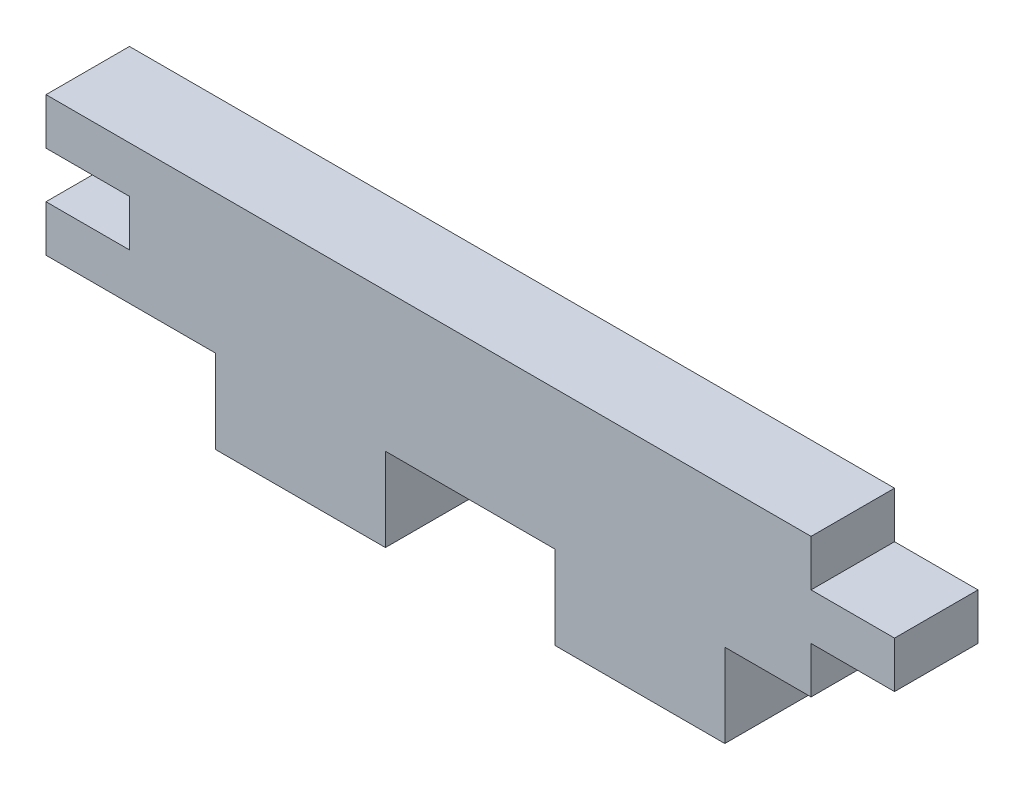
ISO-10303-21;
HEADER;
FILE_DESCRIPTION(('STEP AP214'),'2;1');
FILE_NAME('part.step','',(''),(''),'','','');
FILE_SCHEMA(('AUTOMOTIVE_DESIGN { 1 0 10303 214 1 1 1 1 }'));
ENDSEC;
DATA;
#1=APPLICATION_CONTEXT('core data for automotive mechanical design processes');
#2=APPLICATION_PROTOCOL_DEFINITION('international standard','automotive_design',2000,#1);
#3=PRODUCT_CONTEXT('',#1,'mechanical');
#4=PRODUCT('Part','Part','',(#3));
#5=PRODUCT_RELATED_PRODUCT_CATEGORY('part','',(#4));
#6=PRODUCT_DEFINITION_FORMATION('','',#4);
#7=PRODUCT_DEFINITION_CONTEXT('part definition',#1,'design');
#8=PRODUCT_DEFINITION('design','',#6,#7);
#9=PRODUCT_DEFINITION_SHAPE('','',#8);
#10=(LENGTH_UNIT() NAMED_UNIT(*) SI_UNIT(.MILLI.,.METRE.));
#11=(NAMED_UNIT(*) PLANE_ANGLE_UNIT() SI_UNIT($,.RADIAN.));
#12=(NAMED_UNIT(*) SI_UNIT($,.STERADIAN.) SOLID_ANGLE_UNIT());
#13=UNCERTAINTY_MEASURE_WITH_UNIT(LENGTH_MEASURE(1.E-05),#10,'distance_accuracy_value','');
#14=(GEOMETRIC_REPRESENTATION_CONTEXT(3) GLOBAL_UNCERTAINTY_ASSIGNED_CONTEXT((#13)) GLOBAL_UNIT_ASSIGNED_CONTEXT((#10,
#11,#12)) REPRESENTATION_CONTEXT('',''));
#15=CARTESIAN_POINT('',(0.,0.,0.));
#16=DIRECTION('',(0.,0.,1.));
#17=DIRECTION('',(1.,0.,0.));
#18=AXIS2_PLACEMENT_3D('',#15,#16,#17);
#19=CARTESIAN_POINT('',(0.,0.,15.24));
#20=DIRECTION('',(1.,0.,0.));
#21=DIRECTION('',(0.,0.,-1.));
#22=AXIS2_PLACEMENT_3D('',#19,#20,#21);
#23=PLANE('',#22);
#24=DIRECTION('',(0.,-1.,0.));
#25=VECTOR('',#24,1.);
#26=CARTESIAN_POINT('',(0.,0.,0.));
#27=LINE('',#26,#25);
#28=CARTESIAN_POINT('',(0.,40.64,0.));
#29=VERTEX_POINT('',#28);
#30=CARTESIAN_POINT('',(0.,32.1733333333333,0.));
#31=VERTEX_POINT('',#30);
#32=EDGE_CURVE('E193',#29,#31,#27,.T.);
#33=ORIENTED_EDGE('',*,*,#32,.T.);
#34=DIRECTION('',(0.,0.,1.));
#35=VECTOR('',#34,1.);
#36=CARTESIAN_POINT('',(0.,32.1733333333333,0.));
#37=LINE('',#36,#35);
#38=CARTESIAN_POINT('',(0.,32.1733333333333,15.24));
#39=VERTEX_POINT('',#38);
#40=EDGE_CURVE('E269',#31,#39,#37,.T.);
#41=ORIENTED_EDGE('',*,*,#40,.T.);
#42=DIRECTION('',(0.,-1.,0.));
#43=VECTOR('',#42,1.);
#44=CARTESIAN_POINT('',(0.,0.,15.24));
#45=LINE('',#44,#43);
#46=CARTESIAN_POINT('',(0.,40.64,15.24));
#47=VERTEX_POINT('',#46);
#48=EDGE_CURVE('E213',#47,#39,#45,.T.);
#49=ORIENTED_EDGE('',*,*,#48,.F.);
#50=DIRECTION('',(0.,0.,-1.));
#51=VECTOR('',#50,1.);
#52=CARTESIAN_POINT('',(0.,40.64,15.24));
#53=LINE('',#52,#51);
#54=EDGE_CURVE('E11',#47,#29,#53,.T.);
#55=ORIENTED_EDGE('',*,*,#54,.T.);
#56=EDGE_LOOP('',(#33,#41,#49,#55));
#57=FACE_BOUND('',#56,.T.);
#58=ADVANCED_FACE('F33',(#57),#23,.F.);
#59=CARTESIAN_POINT('',(0.,0.,15.24));
#60=DIRECTION('',(0.,1.,0.));
#61=DIRECTION('',(0.,0.,1.));
#62=AXIS2_PLACEMENT_3D('',#59,#60,#61);
#63=PLANE('',#62);
#64=DIRECTION('',(1.,0.,0.));
#65=VECTOR('',#64,1.);
#66=CARTESIAN_POINT('',(0.,0.,15.24));
#67=LINE('',#66,#65);
#68=CARTESIAN_POINT('',(30.988,0.,15.24));
#69=VERTEX_POINT('',#68);
#70=CARTESIAN_POINT('',(61.976,0.,15.24));
#71=VERTEX_POINT('',#70);
#72=EDGE_CURVE('E225',#69,#71,#67,.T.);
#73=ORIENTED_EDGE('',*,*,#72,.F.);
#74=DIRECTION('',(0.,0.,1.));
#75=VECTOR('',#74,1.);
#76=CARTESIAN_POINT('',(30.988,0.,0.));
#77=LINE('',#76,#75);
#78=CARTESIAN_POINT('',(30.988,0.,0.));
#79=VERTEX_POINT('',#78);
#80=EDGE_CURVE('E245',#79,#69,#77,.T.);
#81=ORIENTED_EDGE('',*,*,#80,.F.);
#82=DIRECTION('',(1.,0.,0.));
#83=VECTOR('',#82,1.);
#84=CARTESIAN_POINT('',(0.,0.,0.));
#85=LINE('',#84,#83);
#86=CARTESIAN_POINT('',(61.976,0.,0.));
#87=VERTEX_POINT('',#86);
#88=EDGE_CURVE('E205',#79,#87,#85,.T.);
#89=ORIENTED_EDGE('',*,*,#88,.T.);
#90=DIRECTION('',(0.,0.,1.));
#91=VECTOR('',#90,1.);
#92=CARTESIAN_POINT('',(61.976,0.,0.));
#93=LINE('',#92,#91);
#94=EDGE_CURVE('E247',#87,#71,#93,.T.);
#95=ORIENTED_EDGE('',*,*,#94,.T.);
#96=EDGE_LOOP('',(#73,#81,#89,#95));
#97=FACE_BOUND('',#96,.T.);
#98=ADVANCED_FACE('F243',(#97),#63,.F.);
#99=CARTESIAN_POINT('',(0.,23.7066666666667,15.24));
#100=VERTEX_POINT('',#99);
#101=CARTESIAN_POINT('',(0.,15.24,15.24));
#102=VERTEX_POINT('',#101);
#103=EDGE_CURVE('E185',#100,#102,#45,.T.);
#104=ORIENTED_EDGE('',*,*,#103,.F.);
#105=DIRECTION('',(0.,0.,1.));
#106=VECTOR('',#105,1.);
#107=CARTESIAN_POINT('',(0.,23.7066666666667,0.));
#108=LINE('',#107,#106);
#109=CARTESIAN_POINT('',(0.,23.7066666666667,0.));
#110=VERTEX_POINT('',#109);
#111=EDGE_CURVE('E173',#110,#100,#108,.T.);
#112=ORIENTED_EDGE('',*,*,#111,.F.);
#113=CARTESIAN_POINT('',(0.,15.24,0.));
#114=VERTEX_POINT('',#113);
#115=EDGE_CURVE('E183',#110,#114,#27,.T.);
#116=ORIENTED_EDGE('',*,*,#115,.T.);
#117=DIRECTION('',(0.,0.,1.));
#118=VECTOR('',#117,1.);
#119=CARTESIAN_POINT('',(0.,15.24,0.));
#120=LINE('',#119,#118);
#121=EDGE_CURVE('E194',#114,#102,#120,.T.);
#122=ORIENTED_EDGE('',*,*,#121,.T.);
#123=EDGE_LOOP('',(#104,#112,#116,#122));
#124=FACE_BOUND('',#123,.T.);
#125=ADVANCED_FACE('F35',(#124),#23,.F.);
#126=CARTESIAN_POINT('',(92.964,0.,15.24));
#127=VERTEX_POINT('',#126);
#128=CARTESIAN_POINT('',(123.952,0.,15.24));
#129=VERTEX_POINT('',#128);
#130=EDGE_CURVE('E219',#127,#129,#67,.T.);
#131=ORIENTED_EDGE('',*,*,#130,.F.);
#132=DIRECTION('',(0.,0.,1.));
#133=VECTOR('',#132,1.);
#134=CARTESIAN_POINT('',(92.964,0.,0.));
#135=LINE('',#134,#133);
#136=CARTESIAN_POINT('',(92.964,0.,0.));
#137=VERTEX_POINT('',#136);
#138=EDGE_CURVE('E251',#137,#127,#135,.T.);
#139=ORIENTED_EDGE('',*,*,#138,.F.);
#140=CARTESIAN_POINT('',(123.952,0.,0.));
#141=VERTEX_POINT('',#140);
#142=EDGE_CURVE('E197',#137,#141,#85,.T.);
#143=ORIENTED_EDGE('',*,*,#142,.T.);
#144=DIRECTION('',(0.,0.,1.));
#145=VECTOR('',#144,1.);
#146=CARTESIAN_POINT('',(123.952,0.,0.));
#147=LINE('',#146,#145);
#148=EDGE_CURVE('E270',#141,#129,#147,.T.);
#149=ORIENTED_EDGE('',*,*,#148,.T.);
#150=EDGE_LOOP('',(#131,#139,#143,#149));
#151=FACE_BOUND('',#150,.T.);
#152=ADVANCED_FACE('F289',(#151),#63,.F.);
#153=CARTESIAN_POINT('',(154.94,0.,15.24));
#154=DIRECTION('',(-1.,0.,0.));
#155=DIRECTION('',(0.,0.,1.));
#156=AXIS2_PLACEMENT_3D('',#153,#154,#155);
#157=PLANE('',#156);
#158=DIRECTION('',(0.,1.,0.));
#159=VECTOR('',#158,1.);
#160=CARTESIAN_POINT('',(154.94,0.,0.));
#161=LINE('',#160,#159);
#162=CARTESIAN_POINT('',(154.94,23.7066666666667,0.));
#163=VERTEX_POINT('',#162);
#164=CARTESIAN_POINT('',(154.94,32.1733333333333,0.));
#165=VERTEX_POINT('',#164);
#166=EDGE_CURVE('E206',#163,#165,#161,.T.);
#167=ORIENTED_EDGE('',*,*,#166,.T.);
#168=DIRECTION('',(0.,0.,1.));
#169=VECTOR('',#168,1.);
#170=CARTESIAN_POINT('',(154.94,32.1733333333333,0.));
#171=LINE('',#170,#169);
#172=CARTESIAN_POINT('',(154.94,32.1733333333333,15.24));
#173=VERTEX_POINT('',#172);
#174=EDGE_CURVE('E426',#165,#173,#171,.T.);
#175=ORIENTED_EDGE('',*,*,#174,.T.);
#176=DIRECTION('',(0.,1.,0.));
#177=VECTOR('',#176,1.);
#178=CARTESIAN_POINT('',(154.94,0.,15.24));
#179=LINE('',#178,#177);
#180=CARTESIAN_POINT('',(154.94,23.7066666666667,15.24));
#181=VERTEX_POINT('',#180);
#182=EDGE_CURVE('E226',#181,#173,#179,.T.);
#183=ORIENTED_EDGE('',*,*,#182,.F.);
#184=DIRECTION('',(0.,0.,1.));
#185=VECTOR('',#184,1.);
#186=CARTESIAN_POINT('',(154.94,23.7066666666667,0.));
#187=LINE('',#186,#185);
#188=EDGE_CURVE('E307',#163,#181,#187,.T.);
#189=ORIENTED_EDGE('',*,*,#188,.F.);
#190=EDGE_LOOP('',(#167,#175,#183,#189));
#191=FACE_BOUND('',#190,.T.);
#192=ADVANCED_FACE('F356',(#191),#157,.F.);
#193=CARTESIAN_POINT('',(0.,40.64,15.24));
#194=DIRECTION('',(0.,-1.,0.));
#195=DIRECTION('',(0.,0.,-1.));
#196=AXIS2_PLACEMENT_3D('',#193,#194,#195);
#197=PLANE('',#196);
#198=DIRECTION('',(-1.,0.,0.));
#199=VECTOR('',#198,1.);
#200=CARTESIAN_POINT('',(0.,40.64,15.24));
#201=LINE('',#200,#199);
#202=CARTESIAN_POINT('',(139.7,40.64,15.24));
#203=VERTEX_POINT('',#202);
#204=EDGE_CURVE('E41',#203,#47,#201,.T.);
#205=ORIENTED_EDGE('',*,*,#204,.F.);
#206=DIRECTION('',(0.,0.,1.));
#207=VECTOR('',#206,1.);
#208=CARTESIAN_POINT('',(139.7,40.64,0.));
#209=LINE('',#208,#207);
#210=CARTESIAN_POINT('',(139.7,40.64,0.));
#211=VERTEX_POINT('',#210);
#212=EDGE_CURVE('E432',#211,#203,#209,.T.);
#213=ORIENTED_EDGE('',*,*,#212,.F.);
#214=DIRECTION('',(-1.,0.,0.));
#215=VECTOR('',#214,1.);
#216=CARTESIAN_POINT('',(0.,40.64,0.));
#217=LINE('',#216,#215);
#218=EDGE_CURVE('E208',#211,#29,#217,.T.);
#219=ORIENTED_EDGE('',*,*,#218,.T.);
#220=ORIENTED_EDGE('',*,*,#54,.F.);
#221=EDGE_LOOP('',(#205,#213,#219,#220));
#222=FACE_BOUND('',#221,.T.);
#223=ADVANCED_FACE('F360',(#222),#197,.F.);
#224=CARTESIAN_POINT('',(0.,0.,15.24));
#225=DIRECTION('',(0.,0.,-1.));
#226=DIRECTION('',(-1.,0.,0.));
#227=AXIS2_PLACEMENT_3D('',#224,#225,#226);
#228=PLANE('',#227);
#229=ORIENTED_EDGE('',*,*,#48,.T.);
#230=DIRECTION('',(-1.,0.,0.));
#231=VECTOR('',#230,1.);
#232=CARTESIAN_POINT('',(0.,32.1733333333333,15.24));
#233=LINE('',#232,#231);
#234=CARTESIAN_POINT('',(15.24,32.1733333333333,15.24));
#235=VERTEX_POINT('',#234);
#236=EDGE_CURVE('E178',#235,#39,#233,.T.);
#237=ORIENTED_EDGE('',*,*,#236,.F.);
#238=DIRECTION('',(0.,1.,0.));
#239=VECTOR('',#238,1.);
#240=CARTESIAN_POINT('',(15.24,32.1733333333333,15.24));
#241=LINE('',#240,#239);
#242=CARTESIAN_POINT('',(15.24,23.7066666666667,15.24));
#243=VERTEX_POINT('',#242);
#244=EDGE_CURVE('E413',#243,#235,#241,.T.);
#245=ORIENTED_EDGE('',*,*,#244,.F.);
#246=DIRECTION('',(1.,0.,0.));
#247=VECTOR('',#246,1.);
#248=CARTESIAN_POINT('',(0.,23.7066666666667,15.24));
#249=LINE('',#248,#247);
#250=EDGE_CURVE('E424',#100,#243,#249,.T.);
#251=ORIENTED_EDGE('',*,*,#250,.F.);
#252=ORIENTED_EDGE('',*,*,#103,.T.);
#253=DIRECTION('',(-1.,0.,0.));
#254=VECTOR('',#253,1.);
#255=CARTESIAN_POINT('',(0.,15.24,15.24));
#256=LINE('',#255,#254);
#257=CARTESIAN_POINT('',(30.988,15.24,15.24));
#258=VERTEX_POINT('',#257);
#259=EDGE_CURVE('E316',#258,#102,#256,.T.);
#260=ORIENTED_EDGE('',*,*,#259,.F.);
#261=DIRECTION('',(0.,1.,0.));
#262=VECTOR('',#261,1.);
#263=CARTESIAN_POINT('',(30.988,15.24,15.24));
#264=LINE('',#263,#262);
#265=EDGE_CURVE('E239',#69,#258,#264,.T.);
#266=ORIENTED_EDGE('',*,*,#265,.F.);
#267=ORIENTED_EDGE('',*,*,#72,.T.);
#268=DIRECTION('',(0.,-1.,0.));
#269=VECTOR('',#268,1.);
#270=CARTESIAN_POINT('',(61.976,0.,15.24));
#271=LINE('',#270,#269);
#272=CARTESIAN_POINT('',(61.976,15.24,15.24));
#273=VERTEX_POINT('',#272);
#274=EDGE_CURVE('E237',#273,#71,#271,.T.);
#275=ORIENTED_EDGE('',*,*,#274,.F.);
#276=DIRECTION('',(-1.,0.,0.));
#277=VECTOR('',#276,1.);
#278=CARTESIAN_POINT('',(61.976,15.24,15.24));
#279=LINE('',#278,#277);
#280=CARTESIAN_POINT('',(92.964,15.24,15.24));
#281=VERTEX_POINT('',#280);
#282=EDGE_CURVE('E325',#281,#273,#279,.T.);
#283=ORIENTED_EDGE('',*,*,#282,.F.);
#284=DIRECTION('',(0.,1.,0.));
#285=VECTOR('',#284,1.);
#286=CARTESIAN_POINT('',(92.964,0.,15.24));
#287=LINE('',#286,#285);
#288=EDGE_CURVE('E274',#127,#281,#287,.T.);
#289=ORIENTED_EDGE('',*,*,#288,.F.);
#290=ORIENTED_EDGE('',*,*,#130,.T.);
#291=DIRECTION('',(0.,-1.,0.));
#292=VECTOR('',#291,1.);
#293=CARTESIAN_POINT('',(123.952,0.,15.24));
#294=LINE('',#293,#292);
#295=CARTESIAN_POINT('',(123.952,15.24,15.24));
#296=VERTEX_POINT('',#295);
#297=EDGE_CURVE('E264',#296,#129,#294,.T.);
#298=ORIENTED_EDGE('',*,*,#297,.F.);
#299=DIRECTION('',(-1.,0.,0.));
#300=VECTOR('',#299,1.);
#301=CARTESIAN_POINT('',(154.94,15.24,15.24));
#302=LINE('',#301,#300);
#303=CARTESIAN_POINT('',(139.7,15.24,15.24));
#304=VERTEX_POINT('',#303);
#305=EDGE_CURVE('E267',#304,#296,#302,.T.);
#306=ORIENTED_EDGE('',*,*,#305,.F.);
#307=DIRECTION('',(0.,-1.,0.));
#308=VECTOR('',#307,1.);
#309=CARTESIAN_POINT('',(139.7,15.24,15.24));
#310=LINE('',#309,#308);
#311=CARTESIAN_POINT('',(139.7,23.7066666666667,15.24));
#312=VERTEX_POINT('',#311);
#313=EDGE_CURVE('E310',#312,#304,#310,.T.);
#314=ORIENTED_EDGE('',*,*,#313,.F.);
#315=DIRECTION('',(-1.,0.,0.));
#316=VECTOR('',#315,1.);
#317=CARTESIAN_POINT('',(154.94,23.7066666666667,15.24));
#318=LINE('',#317,#316);
#319=EDGE_CURVE('E442',#181,#312,#318,.T.);
#320=ORIENTED_EDGE('',*,*,#319,.F.);
#321=ORIENTED_EDGE('',*,*,#182,.T.);
#322=DIRECTION('',(1.,0.,0.));
#323=VECTOR('',#322,1.);
#324=CARTESIAN_POINT('',(154.94,32.1733333333333,15.24));
#325=LINE('',#324,#323);
#326=CARTESIAN_POINT('',(139.7,32.1733333333333,15.24));
#327=VERTEX_POINT('',#326);
#328=EDGE_CURVE('E305',#327,#173,#325,.T.);
#329=ORIENTED_EDGE('',*,*,#328,.F.);
#330=DIRECTION('',(0.,-1.,0.));
#331=VECTOR('',#330,1.);
#332=CARTESIAN_POINT('',(139.7,40.64,15.24));
#333=LINE('',#332,#331);
#334=EDGE_CURVE('E301',#203,#327,#333,.T.);
#335=ORIENTED_EDGE('',*,*,#334,.F.);
#336=ORIENTED_EDGE('',*,*,#204,.T.);
#337=EDGE_LOOP('',(#229,#237,#245,#251,#252,#260,#266,#267,#275,#283,#289,#290,#298,#306,#314,
#320,#321,#329,#335,#336));
#338=FACE_BOUND('',#337,.T.);
#339=ADVANCED_FACE('F235',(#338),#228,.F.);
#340=CARTESIAN_POINT('',(0.,0.,0.));
#341=DIRECTION('',(0.,0.,-1.));
#342=DIRECTION('',(-1.,0.,0.));
#343=AXIS2_PLACEMENT_3D('',#340,#341,#342);
#344=PLANE('',#343);
#345=DIRECTION('',(-1.,0.,0.));
#346=VECTOR('',#345,1.);
#347=CARTESIAN_POINT('',(0.,32.1733333333333,0.));
#348=LINE('',#347,#346);
#349=CARTESIAN_POINT('',(15.24,32.1733333333333,0.));
#350=VERTEX_POINT('',#349);
#351=EDGE_CURVE('E186',#350,#31,#348,.T.);
#352=ORIENTED_EDGE('',*,*,#351,.T.);
#353=ORIENTED_EDGE('',*,*,#32,.F.);
#354=ORIENTED_EDGE('',*,*,#218,.F.);
#355=DIRECTION('',(0.,-1.,0.));
#356=VECTOR('',#355,1.);
#357=CARTESIAN_POINT('',(139.7,40.64,0.));
#358=LINE('',#357,#356);
#359=CARTESIAN_POINT('',(139.7,32.1733333333333,0.));
#360=VERTEX_POINT('',#359);
#361=EDGE_CURVE('E430',#211,#360,#358,.T.);
#362=ORIENTED_EDGE('',*,*,#361,.T.);
#363=DIRECTION('',(1.,0.,0.));
#364=VECTOR('',#363,1.);
#365=CARTESIAN_POINT('',(154.94,32.1733333333333,0.));
#366=LINE('',#365,#364);
#367=EDGE_CURVE('E56',#360,#165,#366,.T.);
#368=ORIENTED_EDGE('',*,*,#367,.T.);
#369=ORIENTED_EDGE('',*,*,#166,.F.);
#370=DIRECTION('',(-1.,0.,0.));
#371=VECTOR('',#370,1.);
#372=CARTESIAN_POINT('',(154.94,23.7066666666667,0.));
#373=LINE('',#372,#371);
#374=CARTESIAN_POINT('',(139.7,23.7066666666667,0.));
#375=VERTEX_POINT('',#374);
#376=EDGE_CURVE('E440',#163,#375,#373,.T.);
#377=ORIENTED_EDGE('',*,*,#376,.T.);
#378=DIRECTION('',(0.,-1.,0.));
#379=VECTOR('',#378,1.);
#380=CARTESIAN_POINT('',(139.7,15.24,0.));
#381=LINE('',#380,#379);
#382=CARTESIAN_POINT('',(139.7,15.24,0.));
#383=VERTEX_POINT('',#382);
#384=EDGE_CURVE('E296',#375,#383,#381,.T.);
#385=ORIENTED_EDGE('',*,*,#384,.T.);
#386=DIRECTION('',(-1.,0.,0.));
#387=VECTOR('',#386,1.);
#388=CARTESIAN_POINT('',(154.94,15.24,0.));
#389=LINE('',#388,#387);
#390=CARTESIAN_POINT('',(123.952,15.24,0.));
#391=VERTEX_POINT('',#390);
#392=EDGE_CURVE('E261',#383,#391,#389,.T.);
#393=ORIENTED_EDGE('',*,*,#392,.T.);
#394=DIRECTION('',(0.,-1.,0.));
#395=VECTOR('',#394,1.);
#396=CARTESIAN_POINT('',(123.952,0.,0.));
#397=LINE('',#396,#395);
#398=EDGE_CURVE('E263',#391,#141,#397,.T.);
#399=ORIENTED_EDGE('',*,*,#398,.T.);
#400=ORIENTED_EDGE('',*,*,#142,.F.);
#401=DIRECTION('',(0.,1.,0.));
#402=VECTOR('',#401,1.);
#403=CARTESIAN_POINT('',(92.964,0.,0.));
#404=LINE('',#403,#402);
#405=CARTESIAN_POINT('',(92.964,15.24,0.));
#406=VERTEX_POINT('',#405);
#407=EDGE_CURVE('E257',#137,#406,#404,.T.);
#408=ORIENTED_EDGE('',*,*,#407,.T.);
#409=DIRECTION('',(-1.,0.,0.));
#410=VECTOR('',#409,1.);
#411=CARTESIAN_POINT('',(61.976,15.24,0.));
#412=LINE('',#411,#410);
#413=CARTESIAN_POINT('',(61.976,15.24,0.));
#414=VERTEX_POINT('',#413);
#415=EDGE_CURVE('E252',#406,#414,#412,.T.);
#416=ORIENTED_EDGE('',*,*,#415,.T.);
#417=DIRECTION('',(0.,-1.,0.));
#418=VECTOR('',#417,1.);
#419=CARTESIAN_POINT('',(61.976,0.,0.));
#420=LINE('',#419,#418);
#421=EDGE_CURVE('E323',#414,#87,#420,.T.);
#422=ORIENTED_EDGE('',*,*,#421,.T.);
#423=ORIENTED_EDGE('',*,*,#88,.F.);
#424=DIRECTION('',(0.,1.,0.));
#425=VECTOR('',#424,1.);
#426=CARTESIAN_POINT('',(30.988,15.24,0.));
#427=LINE('',#426,#425);
#428=CARTESIAN_POINT('',(30.988,15.24,0.));
#429=VERTEX_POINT('',#428);
#430=EDGE_CURVE('E314',#79,#429,#427,.T.);
#431=ORIENTED_EDGE('',*,*,#430,.T.);
#432=DIRECTION('',(-1.,0.,0.));
#433=VECTOR('',#432,1.);
#434=CARTESIAN_POINT('',(0.,15.24,0.));
#435=LINE('',#434,#433);
#436=EDGE_CURVE('E192',#429,#114,#435,.T.);
#437=ORIENTED_EDGE('',*,*,#436,.T.);
#438=ORIENTED_EDGE('',*,*,#115,.F.);
#439=DIRECTION('',(1.,0.,0.));
#440=VECTOR('',#439,1.);
#441=CARTESIAN_POINT('',(0.,23.7066666666667,0.));
#442=LINE('',#441,#440);
#443=CARTESIAN_POINT('',(15.24,23.7066666666667,0.));
#444=VERTEX_POINT('',#443);
#445=EDGE_CURVE('E169',#110,#444,#442,.T.);
#446=ORIENTED_EDGE('',*,*,#445,.T.);
#447=DIRECTION('',(0.,1.,0.));
#448=VECTOR('',#447,1.);
#449=CARTESIAN_POINT('',(15.24,32.1733333333333,0.));
#450=LINE('',#449,#448);
#451=EDGE_CURVE('E48',#444,#350,#450,.T.);
#452=ORIENTED_EDGE('',*,*,#451,.T.);
#453=EDGE_LOOP('',(#352,#353,#354,#362,#368,#369,#377,#385,#393,#399,#400,#408,#416,#422,#423,
#431,#437,#438,#446,#452));
#454=FACE_BOUND('',#453,.T.);
#455=ADVANCED_FACE('F190',(#454),#344,.T.);
#456=CARTESIAN_POINT('',(123.952,0.,0.));
#457=DIRECTION('',(-1.,0.,0.));
#458=DIRECTION('',(0.,0.,1.));
#459=AXIS2_PLACEMENT_3D('',#456,#457,#458);
#460=PLANE('',#459);
#461=ORIENTED_EDGE('',*,*,#297,.T.);
#462=ORIENTED_EDGE('',*,*,#148,.F.);
#463=ORIENTED_EDGE('',*,*,#398,.F.);
#464=DIRECTION('',(0.,0.,1.));
#465=VECTOR('',#464,1.);
#466=CARTESIAN_POINT('',(123.952,15.24,0.));
#467=LINE('',#466,#465);
#468=EDGE_CURVE('E222',#391,#296,#467,.T.);
#469=ORIENTED_EDGE('',*,*,#468,.T.);
#470=EDGE_LOOP('',(#461,#462,#463,#469));
#471=FACE_BOUND('',#470,.T.);
#472=ADVANCED_FACE('F281',(#471),#460,.F.);
#473=CARTESIAN_POINT('',(154.94,15.24,0.));
#474=DIRECTION('',(0.,1.,0.));
#475=DIRECTION('',(0.,0.,1.));
#476=AXIS2_PLACEMENT_3D('',#473,#474,#475);
#477=PLANE('',#476);
#478=ORIENTED_EDGE('',*,*,#392,.F.);
#479=DIRECTION('',(0.,0.,1.));
#480=VECTOR('',#479,1.);
#481=CARTESIAN_POINT('',(139.7,15.24,0.));
#482=LINE('',#481,#480);
#483=EDGE_CURVE('E299',#383,#304,#482,.T.);
#484=ORIENTED_EDGE('',*,*,#483,.T.);
#485=ORIENTED_EDGE('',*,*,#305,.T.);
#486=ORIENTED_EDGE('',*,*,#468,.F.);
#487=EDGE_LOOP('',(#478,#484,#485,#486));
#488=FACE_BOUND('',#487,.T.);
#489=ADVANCED_FACE('F298',(#488),#477,.F.);
#490=CARTESIAN_POINT('',(61.976,0.,0.));
#491=DIRECTION('',(-1.,0.,0.));
#492=DIRECTION('',(0.,0.,1.));
#493=AXIS2_PLACEMENT_3D('',#490,#491,#492);
#494=PLANE('',#493);
#495=ORIENTED_EDGE('',*,*,#274,.T.);
#496=ORIENTED_EDGE('',*,*,#94,.F.);
#497=ORIENTED_EDGE('',*,*,#421,.F.);
#498=DIRECTION('',(0.,0.,1.));
#499=VECTOR('',#498,1.);
#500=CARTESIAN_POINT('',(61.976,15.24,0.));
#501=LINE('',#500,#499);
#502=EDGE_CURVE('E319',#414,#273,#501,.T.);
#503=ORIENTED_EDGE('',*,*,#502,.T.);
#504=EDGE_LOOP('',(#495,#496,#497,#503));
#505=FACE_BOUND('',#504,.T.);
#506=ADVANCED_FACE('F344',(#505),#494,.F.);
#507=CARTESIAN_POINT('',(61.976,15.24,0.));
#508=DIRECTION('',(0.,1.,0.));
#509=DIRECTION('',(-1.,0.,0.));
#510=AXIS2_PLACEMENT_3D('',#507,#508,#509);
#511=PLANE('',#510);
#512=ORIENTED_EDGE('',*,*,#282,.T.);
#513=ORIENTED_EDGE('',*,*,#502,.F.);
#514=ORIENTED_EDGE('',*,*,#415,.F.);
#515=DIRECTION('',(0.,0.,1.));
#516=VECTOR('',#515,1.);
#517=CARTESIAN_POINT('',(92.964,15.24,0.));
#518=LINE('',#517,#516);
#519=EDGE_CURVE('E254',#406,#281,#518,.T.);
#520=ORIENTED_EDGE('',*,*,#519,.T.);
#521=EDGE_LOOP('',(#512,#513,#514,#520));
#522=FACE_BOUND('',#521,.T.);
#523=ADVANCED_FACE('F332',(#522),#511,.F.);
#524=CARTESIAN_POINT('',(92.964,0.,0.));
#525=DIRECTION('',(1.,0.,0.));
#526=DIRECTION('',(0.,0.,-1.));
#527=AXIS2_PLACEMENT_3D('',#524,#525,#526);
#528=PLANE('',#527);
#529=ORIENTED_EDGE('',*,*,#288,.T.);
#530=ORIENTED_EDGE('',*,*,#519,.F.);
#531=ORIENTED_EDGE('',*,*,#407,.F.);
#532=ORIENTED_EDGE('',*,*,#138,.T.);
#533=EDGE_LOOP('',(#529,#530,#531,#532));
#534=FACE_BOUND('',#533,.T.);
#535=ADVANCED_FACE('F333',(#534),#528,.F.);
#536=CARTESIAN_POINT('',(0.,15.24,0.));
#537=DIRECTION('',(0.,1.,0.));
#538=DIRECTION('',(0.,0.,1.));
#539=AXIS2_PLACEMENT_3D('',#536,#537,#538);
#540=PLANE('',#539);
#541=ORIENTED_EDGE('',*,*,#259,.T.);
#542=ORIENTED_EDGE('',*,*,#121,.F.);
#543=ORIENTED_EDGE('',*,*,#436,.F.);
#544=DIRECTION('',(0.,0.,1.));
#545=VECTOR('',#544,1.);
#546=CARTESIAN_POINT('',(30.988,15.24,0.));
#547=LINE('',#546,#545);
#548=EDGE_CURVE('E198',#429,#258,#547,.T.);
#549=ORIENTED_EDGE('',*,*,#548,.T.);
#550=EDGE_LOOP('',(#541,#542,#543,#549));
#551=FACE_BOUND('',#550,.T.);
#552=ADVANCED_FACE('F335',(#551),#540,.F.);
#553=CARTESIAN_POINT('',(30.988,15.24,0.));
#554=DIRECTION('',(1.,0.,0.));
#555=DIRECTION('',(0.,1.,0.));
#556=AXIS2_PLACEMENT_3D('',#553,#554,#555);
#557=PLANE('',#556);
#558=ORIENTED_EDGE('',*,*,#265,.T.);
#559=ORIENTED_EDGE('',*,*,#548,.F.);
#560=ORIENTED_EDGE('',*,*,#430,.F.);
#561=ORIENTED_EDGE('',*,*,#80,.T.);
#562=EDGE_LOOP('',(#558,#559,#560,#561));
#563=FACE_BOUND('',#562,.T.);
#564=ADVANCED_FACE('F341',(#563),#557,.F.);
#565=CARTESIAN_POINT('',(139.7,15.24,0.));
#566=DIRECTION('',(-1.,0.,0.));
#567=DIRECTION('',(0.,0.,1.));
#568=AXIS2_PLACEMENT_3D('',#565,#566,#567);
#569=PLANE('',#568);
#570=ORIENTED_EDGE('',*,*,#313,.T.);
#571=ORIENTED_EDGE('',*,*,#483,.F.);
#572=ORIENTED_EDGE('',*,*,#384,.F.);
#573=DIRECTION('',(0.,0.,1.));
#574=VECTOR('',#573,1.);
#575=CARTESIAN_POINT('',(139.7,23.7066666666667,0.));
#576=LINE('',#575,#574);
#577=EDGE_CURVE('E302',#375,#312,#576,.T.);
#578=ORIENTED_EDGE('',*,*,#577,.T.);
#579=EDGE_LOOP('',(#570,#571,#572,#578));
#580=FACE_BOUND('',#579,.T.);
#581=ADVANCED_FACE('F379',(#580),#569,.F.);
#582=CARTESIAN_POINT('',(154.94,23.7066666666667,0.));
#583=DIRECTION('',(0.,1.,0.));
#584=DIRECTION('',(0.,0.,1.));
#585=AXIS2_PLACEMENT_3D('',#582,#583,#584);
#586=PLANE('',#585);
#587=ORIENTED_EDGE('',*,*,#319,.T.);
#588=ORIENTED_EDGE('',*,*,#577,.F.);
#589=ORIENTED_EDGE('',*,*,#376,.F.);
#590=ORIENTED_EDGE('',*,*,#188,.T.);
#591=EDGE_LOOP('',(#587,#588,#589,#590));
#592=FACE_BOUND('',#591,.T.);
#593=ADVANCED_FACE('F384',(#592),#586,.F.);
#594=CARTESIAN_POINT('',(154.94,32.1733333333333,0.));
#595=DIRECTION('',(0.,-1.,0.));
#596=DIRECTION('',(0.,0.,-1.));
#597=AXIS2_PLACEMENT_3D('',#594,#595,#596);
#598=PLANE('',#597);
#599=ORIENTED_EDGE('',*,*,#328,.T.);
#600=ORIENTED_EDGE('',*,*,#174,.F.);
#601=ORIENTED_EDGE('',*,*,#367,.F.);
#602=DIRECTION('',(0.,0.,1.));
#603=VECTOR('',#602,1.);
#604=CARTESIAN_POINT('',(139.7,32.1733333333333,0.));
#605=LINE('',#604,#603);
#606=EDGE_CURVE('E437',#360,#327,#605,.T.);
#607=ORIENTED_EDGE('',*,*,#606,.T.);
#608=EDGE_LOOP('',(#599,#600,#601,#607));
#609=FACE_BOUND('',#608,.T.);
#610=ADVANCED_FACE('F388',(#609),#598,.F.);
#611=CARTESIAN_POINT('',(139.7,40.64,0.));
#612=DIRECTION('',(-1.,0.,0.));
#613=DIRECTION('',(0.,0.,1.));
#614=AXIS2_PLACEMENT_3D('',#611,#612,#613);
#615=PLANE('',#614);
#616=ORIENTED_EDGE('',*,*,#334,.T.);
#617=ORIENTED_EDGE('',*,*,#606,.F.);
#618=ORIENTED_EDGE('',*,*,#361,.F.);
#619=ORIENTED_EDGE('',*,*,#212,.T.);
#620=EDGE_LOOP('',(#616,#617,#618,#619));
#621=FACE_BOUND('',#620,.T.);
#622=ADVANCED_FACE('F391',(#621),#615,.F.);
#623=CARTESIAN_POINT('',(0.,32.1733333333333,0.));
#624=DIRECTION('',(0.,1.,0.));
#625=DIRECTION('',(-1.,0.,0.));
#626=AXIS2_PLACEMENT_3D('',#623,#624,#625);
#627=PLANE('',#626);
#628=ORIENTED_EDGE('',*,*,#236,.T.);
#629=ORIENTED_EDGE('',*,*,#40,.F.);
#630=ORIENTED_EDGE('',*,*,#351,.F.);
#631=DIRECTION('',(0.,0.,1.));
#632=VECTOR('',#631,1.);
#633=CARTESIAN_POINT('',(15.24,32.1733333333333,0.));
#634=LINE('',#633,#632);
#635=EDGE_CURVE('E410',#350,#235,#634,.T.);
#636=ORIENTED_EDGE('',*,*,#635,.T.);
#637=EDGE_LOOP('',(#628,#629,#630,#636));
#638=FACE_BOUND('',#637,.T.);
#639=ADVANCED_FACE('F394',(#638),#627,.F.);
#640=CARTESIAN_POINT('',(15.24,32.1733333333333,0.));
#641=DIRECTION('',(1.,0.,0.));
#642=DIRECTION('',(0.,0.,-1.));
#643=AXIS2_PLACEMENT_3D('',#640,#641,#642);
#644=PLANE('',#643);
#645=ORIENTED_EDGE('',*,*,#244,.T.);
#646=ORIENTED_EDGE('',*,*,#635,.F.);
#647=ORIENTED_EDGE('',*,*,#451,.F.);
#648=DIRECTION('',(0.,0.,1.));
#649=VECTOR('',#648,1.);
#650=CARTESIAN_POINT('',(15.24,23.7066666666667,0.));
#651=LINE('',#650,#649);
#652=EDGE_CURVE('E175',#444,#243,#651,.T.);
#653=ORIENTED_EDGE('',*,*,#652,.T.);
#654=EDGE_LOOP('',(#645,#646,#647,#653));
#655=FACE_BOUND('',#654,.T.);
#656=ADVANCED_FACE('F400',(#655),#644,.F.);
#657=CARTESIAN_POINT('',(0.,23.7066666666667,0.));
#658=DIRECTION('',(0.,-1.,0.));
#659=DIRECTION('',(0.,0.,-1.));
#660=AXIS2_PLACEMENT_3D('',#657,#658,#659);
#661=PLANE('',#660);
#662=ORIENTED_EDGE('',*,*,#250,.T.);
#663=ORIENTED_EDGE('',*,*,#652,.F.);
#664=ORIENTED_EDGE('',*,*,#445,.F.);
#665=ORIENTED_EDGE('',*,*,#111,.T.);
#666=EDGE_LOOP('',(#662,#663,#664,#665));
#667=FACE_BOUND('',#666,.T.);
#668=ADVANCED_FACE('F172',(#667),#661,.F.);
#669=CLOSED_SHELL('',(#58,#98,#125,#152,#192,#223,#339,#455,#472,#489,#506,#523,#535,#552,#564,
#581,#593,#610,#622,#639,#656,#668));
#670=MANIFOLD_SOLID_BREP('B2',#669);
#671=ADVANCED_BREP_SHAPE_REPRESENTATION('',(#18,#670),#14);
#672=SHAPE_DEFINITION_REPRESENTATION(#9,#671);
ENDSEC;
END-ISO-10303-21;
